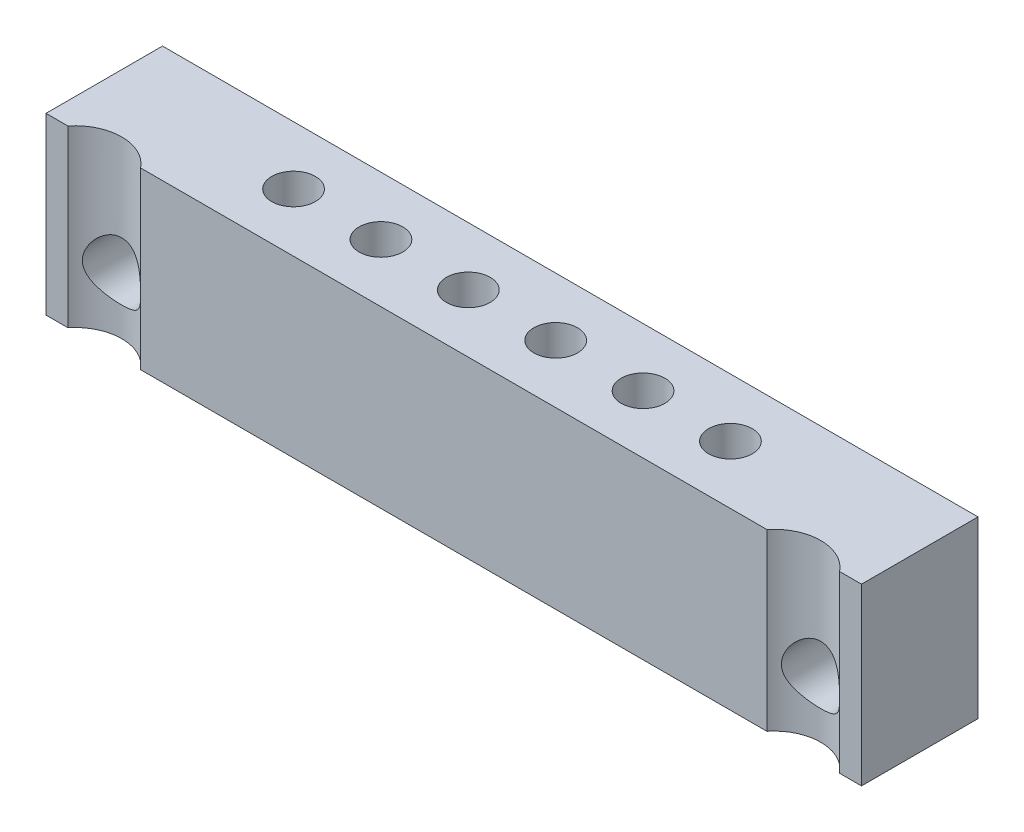
ISO-10303-21;
HEADER;
FILE_DESCRIPTION(('STEP AP214'),'2;1');
FILE_NAME('part.step','',(''),(''),'','','');
FILE_SCHEMA(('AUTOMOTIVE_DESIGN { 1 0 10303 214 1 1 1 1 }'));
ENDSEC;
DATA;
#1=APPLICATION_CONTEXT('core data for automotive mechanical design processes');
#2=APPLICATION_PROTOCOL_DEFINITION('international standard','automotive_design',2000,#1);
#3=PRODUCT_CONTEXT('',#1,'mechanical');
#4=PRODUCT('Part','Part','',(#3));
#5=PRODUCT_RELATED_PRODUCT_CATEGORY('part','',(#4));
#6=PRODUCT_DEFINITION_FORMATION('','',#4);
#7=PRODUCT_DEFINITION_CONTEXT('part definition',#1,'design');
#8=PRODUCT_DEFINITION('design','',#6,#7);
#9=PRODUCT_DEFINITION_SHAPE('','',#8);
#10=(LENGTH_UNIT() NAMED_UNIT(*) SI_UNIT(.MILLI.,.METRE.));
#11=(NAMED_UNIT(*) PLANE_ANGLE_UNIT() SI_UNIT($,.RADIAN.));
#12=(NAMED_UNIT(*) SI_UNIT($,.STERADIAN.) SOLID_ANGLE_UNIT());
#13=UNCERTAINTY_MEASURE_WITH_UNIT(LENGTH_MEASURE(1.E-05),#10,'distance_accuracy_value','');
#14=(GEOMETRIC_REPRESENTATION_CONTEXT(3) GLOBAL_UNCERTAINTY_ASSIGNED_CONTEXT((#13)) GLOBAL_UNIT_ASSIGNED_CONTEXT((#10,
#11,#12)) REPRESENTATION_CONTEXT('',''));
#15=CARTESIAN_POINT('',(0.,0.,0.));
#16=DIRECTION('',(0.,0.,1.));
#17=DIRECTION('',(1.,0.,0.));
#18=AXIS2_PLACEMENT_3D('',#15,#16,#17);
#19=CARTESIAN_POINT('',(0.,0.,4.));
#20=DIRECTION('',(0.,0.,-1.));
#21=DIRECTION('',(-1.,0.,0.));
#22=AXIS2_PLACEMENT_3D('',#19,#20,#21);
#23=PLANE('',#22);
#24=DIRECTION('',(-1.,0.,0.));
#25=VECTOR('',#24,1.);
#26=CARTESIAN_POINT('',(0.,6.,4.));
#27=LINE('',#26,#25);
#28=CARTESIAN_POINT('',(24.7510004003203,6.,4.));
#29=VERTEX_POINT('',#28);
#30=CARTESIAN_POINT('',(3.24899959967968,6.,4.));
#31=VERTEX_POINT('',#30);
#32=EDGE_CURVE('E119',#29,#31,#27,.T.);
#33=ORIENTED_EDGE('',*,*,#32,.T.);
#34=DIRECTION('',(0.,-1.,0.));
#35=VECTOR('',#34,1.);
#36=CARTESIAN_POINT('',(3.24899959967968,6.,4.));
#37=LINE('',#36,#35);
#38=CARTESIAN_POINT('',(3.24899959967968,0.,4.));
#39=VERTEX_POINT('',#38);
#40=EDGE_CURVE('E57',#31,#39,#37,.T.);
#41=ORIENTED_EDGE('',*,*,#40,.T.);
#42=DIRECTION('',(1.,0.,0.));
#43=VECTOR('',#42,1.);
#44=CARTESIAN_POINT('',(0.,0.,4.));
#45=LINE('',#44,#43);
#46=CARTESIAN_POINT('',(24.7510004003203,0.,4.));
#47=VERTEX_POINT('',#46);
#48=EDGE_CURVE('E121',#39,#47,#45,.T.);
#49=ORIENTED_EDGE('',*,*,#48,.T.);
#50=DIRECTION('',(0.,-1.,0.));
#51=VECTOR('',#50,1.);
#52=CARTESIAN_POINT('',(24.7510004003203,6.,4.));
#53=LINE('',#52,#51);
#54=EDGE_CURVE('E107',#47,#29,#53,.F.);
#55=ORIENTED_EDGE('',*,*,#54,.T.);
#56=EDGE_LOOP('',(#33,#41,#49,#55));
#57=FACE_BOUND('',#56,.T.);
#58=ADVANCED_FACE('F35',(#57),#23,.F.);
#59=CARTESIAN_POINT('',(28.,6.,4.));
#60=VERTEX_POINT('',#59);
#61=CARTESIAN_POINT('',(27.2489995996797,6.,4.));
#62=VERTEX_POINT('',#61);
#63=EDGE_CURVE('E127',#60,#62,#27,.T.);
#64=ORIENTED_EDGE('',*,*,#63,.T.);
#65=DIRECTION('',(0.,-1.,0.));
#66=VECTOR('',#65,1.);
#67=CARTESIAN_POINT('',(27.2489995996797,6.,4.));
#68=LINE('',#67,#66);
#69=CARTESIAN_POINT('',(27.2489995996797,0.,4.));
#70=VERTEX_POINT('',#69);
#71=EDGE_CURVE('E65',#62,#70,#68,.T.);
#72=ORIENTED_EDGE('',*,*,#71,.T.);
#73=CARTESIAN_POINT('',(28.,0.,4.));
#74=VERTEX_POINT('',#73);
#75=EDGE_CURVE('E215',#70,#74,#45,.T.);
#76=ORIENTED_EDGE('',*,*,#75,.T.);
#77=DIRECTION('',(0.,1.,0.));
#78=VECTOR('',#77,1.);
#79=CARTESIAN_POINT('',(28.,0.,4.));
#80=LINE('',#79,#78);
#81=EDGE_CURVE('E131',#74,#60,#80,.T.);
#82=ORIENTED_EDGE('',*,*,#81,.T.);
#83=EDGE_LOOP('',(#64,#72,#76,#82));
#84=FACE_BOUND('',#83,.T.);
#85=ADVANCED_FACE('F191',(#84),#23,.F.);
#86=CARTESIAN_POINT('',(0.,0.,4.));
#87=VERTEX_POINT('',#86);
#88=CARTESIAN_POINT('',(0.751000400320321,0.,4.));
#89=VERTEX_POINT('',#88);
#90=EDGE_CURVE('E209',#87,#89,#45,.T.);
#91=ORIENTED_EDGE('',*,*,#90,.T.);
#92=DIRECTION('',(0.,-1.,0.));
#93=VECTOR('',#92,1.);
#94=CARTESIAN_POINT('',(0.75100040032032,6.,4.));
#95=LINE('',#94,#93);
#96=CARTESIAN_POINT('',(0.751000400320321,6.,4.));
#97=VERTEX_POINT('',#96);
#98=EDGE_CURVE('E210',#89,#97,#95,.F.);
#99=ORIENTED_EDGE('',*,*,#98,.T.);
#100=CARTESIAN_POINT('',(0.,6.,4.));
#101=VERTEX_POINT('',#100);
#102=EDGE_CURVE('E128',#97,#101,#27,.T.);
#103=ORIENTED_EDGE('',*,*,#102,.T.);
#104=DIRECTION('',(0.,-1.,0.));
#105=VECTOR('',#104,1.);
#106=CARTESIAN_POINT('',(0.,0.,4.));
#107=LINE('',#106,#105);
#108=EDGE_CURVE('E145',#101,#87,#107,.T.);
#109=ORIENTED_EDGE('',*,*,#108,.T.);
#110=EDGE_LOOP('',(#91,#99,#103,#109));
#111=FACE_BOUND('',#110,.T.);
#112=ADVANCED_FACE('F193',(#111),#23,.F.);
#113=CARTESIAN_POINT('',(0.,0.,0.));
#114=DIRECTION('',(0.,0.,-1.));
#115=DIRECTION('',(-1.,0.,0.));
#116=AXIS2_PLACEMENT_3D('',#113,#114,#115);
#117=PLANE('',#116);
#118=CARTESIAN_POINT('',(2.,2.,0.));
#119=DIRECTION('',(0.,0.,1.));
#120=DIRECTION('',(1.,0.,0.));
#121=AXIS2_PLACEMENT_3D('',#118,#119,#120);
#122=CIRCLE('',#121,1.);
#123=CARTESIAN_POINT('',(3.,2.,0.));
#124=VERTEX_POINT('',#123);
#125=EDGE_CURVE('E139',#124,#124,#122,.T.);
#126=ORIENTED_EDGE('',*,*,#125,.T.);
#127=EDGE_LOOP('',(#126));
#128=FACE_BOUND('',#127,.T.);
#129=DIRECTION('',(0.,-1.,0.));
#130=VECTOR('',#129,1.);
#131=CARTESIAN_POINT('',(0.,0.,0.));
#132=LINE('',#131,#130);
#133=CARTESIAN_POINT('',(0.,6.,0.));
#134=VERTEX_POINT('',#133);
#135=CARTESIAN_POINT('',(0.,0.,0.));
#136=VERTEX_POINT('',#135);
#137=EDGE_CURVE('E135',#134,#136,#132,.T.);
#138=ORIENTED_EDGE('',*,*,#137,.F.);
#139=DIRECTION('',(-1.,0.,0.));
#140=VECTOR('',#139,1.);
#141=CARTESIAN_POINT('',(0.,6.,0.));
#142=LINE('',#141,#140);
#143=CARTESIAN_POINT('',(28.,6.,0.));
#144=VERTEX_POINT('',#143);
#145=EDGE_CURVE('E143',#144,#134,#142,.T.);
#146=ORIENTED_EDGE('',*,*,#145,.F.);
#147=DIRECTION('',(0.,1.,0.));
#148=VECTOR('',#147,1.);
#149=CARTESIAN_POINT('',(28.,0.,0.));
#150=LINE('',#149,#148);
#151=CARTESIAN_POINT('',(28.,0.,0.));
#152=VERTEX_POINT('',#151);
#153=EDGE_CURVE('E141',#152,#144,#150,.T.);
#154=ORIENTED_EDGE('',*,*,#153,.F.);
#155=DIRECTION('',(1.,0.,0.));
#156=VECTOR('',#155,1.);
#157=CARTESIAN_POINT('',(0.,0.,0.));
#158=LINE('',#157,#156);
#159=EDGE_CURVE('E138',#136,#152,#158,.T.);
#160=ORIENTED_EDGE('',*,*,#159,.F.);
#161=EDGE_LOOP('',(#138,#146,#154,#160));
#162=FACE_BOUND('',#161,.T.);
#163=CARTESIAN_POINT('',(26.,2.,0.));
#164=DIRECTION('',(0.,0.,1.));
#165=DIRECTION('',(-1.,0.,0.));
#166=AXIS2_PLACEMENT_3D('',#163,#164,#165);
#167=CIRCLE('',#166,1.);
#168=CARTESIAN_POINT('',(25.,2.,0.));
#169=VERTEX_POINT('',#168);
#170=EDGE_CURVE('E222',#169,#169,#167,.T.);
#171=ORIENTED_EDGE('',*,*,#170,.T.);
#172=EDGE_LOOP('',(#171));
#173=FACE_BOUND('',#172,.T.);
#174=ADVANCED_FACE('F200',(#128,#162,#173),#117,.T.);
#175=CARTESIAN_POINT('',(0.,0.,4.));
#176=DIRECTION('',(1.,0.,0.));
#177=DIRECTION('',(0.,0.,-1.));
#178=AXIS2_PLACEMENT_3D('',#175,#176,#177);
#179=PLANE('',#178);
#180=ORIENTED_EDGE('',*,*,#137,.T.);
#181=DIRECTION('',(0.,0.,-1.));
#182=VECTOR('',#181,1.);
#183=CARTESIAN_POINT('',(0.,0.,4.));
#184=LINE('',#183,#182);
#185=EDGE_CURVE('E11',#87,#136,#184,.T.);
#186=ORIENTED_EDGE('',*,*,#185,.F.);
#187=ORIENTED_EDGE('',*,*,#108,.F.);
#188=DIRECTION('',(0.,0.,-1.));
#189=VECTOR('',#188,1.);
#190=CARTESIAN_POINT('',(0.,6.,4.));
#191=LINE('',#190,#189);
#192=EDGE_CURVE('E130',#101,#134,#191,.T.);
#193=ORIENTED_EDGE('',*,*,#192,.T.);
#194=EDGE_LOOP('',(#180,#186,#187,#193));
#195=FACE_BOUND('',#194,.T.);
#196=ADVANCED_FACE('F37',(#195),#179,.F.);
#197=CARTESIAN_POINT('',(0.,0.,4.));
#198=DIRECTION('',(0.,1.,0.));
#199=DIRECTION('',(0.,0.,1.));
#200=AXIS2_PLACEMENT_3D('',#197,#198,#199);
#201=PLANE('',#200);
#202=CARTESIAN_POINT('',(15.5,0.,2.));
#203=DIRECTION('',(0.,-1.,0.));
#204=DIRECTION('',(0.,0.,1.));
#205=AXIS2_PLACEMENT_3D('',#202,#203,#204);
#206=CIRCLE('',#205,0.750000000000002);
#207=CARTESIAN_POINT('',(15.5,0.,2.75));
#208=VERTEX_POINT('',#207);
#209=EDGE_CURVE('E113',#208,#208,#206,.T.);
#210=ORIENTED_EDGE('',*,*,#209,.F.);
#211=EDGE_LOOP('',(#210));
#212=FACE_BOUND('',#211,.T.);
#213=CARTESIAN_POINT('',(18.5,0.,1.99999999999998));
#214=DIRECTION('',(0.,-1.,0.));
#215=DIRECTION('',(0.,0.,1.));
#216=AXIS2_PLACEMENT_3D('',#213,#214,#215);
#217=CIRCLE('',#216,0.750000000000002);
#218=CARTESIAN_POINT('',(18.5,0.,2.74999999999998));
#219=VERTEX_POINT('',#218);
#220=EDGE_CURVE('E260',#219,#219,#217,.T.);
#221=ORIENTED_EDGE('',*,*,#220,.F.);
#222=EDGE_LOOP('',(#221));
#223=FACE_BOUND('',#222,.T.);
#224=CARTESIAN_POINT('',(6.5,0.,1.99999999999996));
#225=DIRECTION('',(0.,-1.,0.));
#226=DIRECTION('',(0.,0.,-1.));
#227=AXIS2_PLACEMENT_3D('',#224,#225,#226);
#228=CIRCLE('',#227,0.75);
#229=CARTESIAN_POINT('',(6.5,0.,1.24999999999996));
#230=VERTEX_POINT('',#229);
#231=EDGE_CURVE('E228',#230,#230,#228,.T.);
#232=ORIENTED_EDGE('',*,*,#231,.F.);
#233=EDGE_LOOP('',(#232));
#234=FACE_BOUND('',#233,.T.);
#235=CARTESIAN_POINT('',(9.5,0.,1.99999999999998));
#236=DIRECTION('',(0.,-1.,0.));
#237=DIRECTION('',(0.,0.,-1.));
#238=AXIS2_PLACEMENT_3D('',#235,#236,#237);
#239=CIRCLE('',#238,0.75);
#240=CARTESIAN_POINT('',(9.5,0.,1.24999999999998));
#241=VERTEX_POINT('',#240);
#242=EDGE_CURVE('E235',#241,#241,#239,.T.);
#243=ORIENTED_EDGE('',*,*,#242,.F.);
#244=EDGE_LOOP('',(#243));
#245=FACE_BOUND('',#244,.T.);
#246=CARTESIAN_POINT('',(21.5,0.,1.99999999999996));
#247=DIRECTION('',(0.,-1.,0.));
#248=DIRECTION('',(0.,0.,1.));
#249=AXIS2_PLACEMENT_3D('',#246,#247,#248);
#250=CIRCLE('',#249,0.750000000000002);
#251=CARTESIAN_POINT('',(21.5,0.,2.74999999999996));
#252=VERTEX_POINT('',#251);
#253=EDGE_CURVE('E241',#252,#252,#250,.T.);
#254=ORIENTED_EDGE('',*,*,#253,.F.);
#255=EDGE_LOOP('',(#254));
#256=FACE_BOUND('',#255,.T.);
#257=CARTESIAN_POINT('',(12.5,0.,2.));
#258=DIRECTION('',(0.,-1.,0.));
#259=DIRECTION('',(0.,0.,-1.));
#260=AXIS2_PLACEMENT_3D('',#257,#258,#259);
#261=CIRCLE('',#260,0.75);
#262=CARTESIAN_POINT('',(12.5,0.,1.25));
#263=VERTEX_POINT('',#262);
#264=EDGE_CURVE('E247',#263,#263,#261,.T.);
#265=ORIENTED_EDGE('',*,*,#264,.F.);
#266=EDGE_LOOP('',(#265));
#267=FACE_BOUND('',#266,.T.);
#268=ORIENTED_EDGE('',*,*,#48,.F.);
#269=CARTESIAN_POINT('',(2.,0.,5.));
#270=DIRECTION('',(0.,-1.,0.));
#271=DIRECTION('',(0.,0.,-1.));
#272=AXIS2_PLACEMENT_3D('',#269,#270,#271);
#273=CIRCLE('',#272,1.6);
#274=EDGE_CURVE('E253',#89,#39,#273,.T.);
#275=ORIENTED_EDGE('',*,*,#274,.F.);
#276=ORIENTED_EDGE('',*,*,#90,.F.);
#277=ORIENTED_EDGE('',*,*,#185,.T.);
#278=ORIENTED_EDGE('',*,*,#159,.T.);
#279=DIRECTION('',(0.,0.,-1.));
#280=VECTOR('',#279,1.);
#281=CARTESIAN_POINT('',(28.,0.,4.));
#282=LINE('',#281,#280);
#283=EDGE_CURVE('E49',#74,#152,#282,.T.);
#284=ORIENTED_EDGE('',*,*,#283,.F.);
#285=ORIENTED_EDGE('',*,*,#75,.F.);
#286=CARTESIAN_POINT('',(26.,0.,5.));
#287=DIRECTION('',(0.,-1.,0.));
#288=DIRECTION('',(0.,0.,1.));
#289=AXIS2_PLACEMENT_3D('',#286,#287,#288);
#290=CIRCLE('',#289,1.6);
#291=EDGE_CURVE('E114',#47,#70,#290,.T.);
#292=ORIENTED_EDGE('',*,*,#291,.F.);
#293=EDGE_LOOP('',(#268,#275,#276,#277,#278,#284,#285,#292));
#294=FACE_BOUND('',#293,.T.);
#295=ADVANCED_FACE('F266',(#212,#223,#234,#245,#256,#267,#294),#201,.F.);
#296=CARTESIAN_POINT('',(28.,0.,4.));
#297=DIRECTION('',(-1.,0.,0.));
#298=DIRECTION('',(0.,0.,1.));
#299=AXIS2_PLACEMENT_3D('',#296,#297,#298);
#300=PLANE('',#299);
#301=ORIENTED_EDGE('',*,*,#153,.T.);
#302=DIRECTION('',(0.,0.,-1.));
#303=VECTOR('',#302,1.);
#304=CARTESIAN_POINT('',(28.,6.,4.));
#305=LINE('',#304,#303);
#306=EDGE_CURVE('E148',#60,#144,#305,.T.);
#307=ORIENTED_EDGE('',*,*,#306,.F.);
#308=ORIENTED_EDGE('',*,*,#81,.F.);
#309=ORIENTED_EDGE('',*,*,#283,.T.);
#310=EDGE_LOOP('',(#301,#307,#308,#309));
#311=FACE_BOUND('',#310,.T.);
#312=ADVANCED_FACE('F277',(#311),#300,.F.);
#313=CARTESIAN_POINT('',(0.,6.,4.));
#314=DIRECTION('',(0.,-1.,0.));
#315=DIRECTION('',(1.,0.,0.));
#316=AXIS2_PLACEMENT_3D('',#313,#314,#315);
#317=PLANE('',#316);
#318=CARTESIAN_POINT('',(15.5,6.,2.));
#319=DIRECTION('',(0.,-1.,0.));
#320=DIRECTION('',(0.,0.,1.));
#321=AXIS2_PLACEMENT_3D('',#318,#319,#320);
#322=CIRCLE('',#321,0.750000000000002);
#323=CARTESIAN_POINT('',(15.5,6.,2.75));
#324=VERTEX_POINT('',#323);
#325=EDGE_CURVE('E257',#324,#324,#322,.T.);
#326=ORIENTED_EDGE('',*,*,#325,.T.);
#327=EDGE_LOOP('',(#326));
#328=FACE_BOUND('',#327,.T.);
#329=CARTESIAN_POINT('',(18.5,6.,1.99999999999998));
#330=DIRECTION('',(0.,-1.,0.));
#331=DIRECTION('',(0.,0.,1.));
#332=AXIS2_PLACEMENT_3D('',#329,#330,#331);
#333=CIRCLE('',#332,0.750000000000002);
#334=CARTESIAN_POINT('',(18.5,6.,2.74999999999998));
#335=VERTEX_POINT('',#334);
#336=EDGE_CURVE('E232',#335,#335,#333,.T.);
#337=ORIENTED_EDGE('',*,*,#336,.T.);
#338=EDGE_LOOP('',(#337));
#339=FACE_BOUND('',#338,.T.);
#340=CARTESIAN_POINT('',(6.5,6.,1.99999999999996));
#341=DIRECTION('',(0.,-1.,0.));
#342=DIRECTION('',(0.,0.,-1.));
#343=AXIS2_PLACEMENT_3D('',#340,#341,#342);
#344=CIRCLE('',#343,0.75);
#345=CARTESIAN_POINT('',(6.5,6.,1.24999999999996));
#346=VERTEX_POINT('',#345);
#347=EDGE_CURVE('E231',#346,#346,#344,.T.);
#348=ORIENTED_EDGE('',*,*,#347,.T.);
#349=EDGE_LOOP('',(#348));
#350=FACE_BOUND('',#349,.T.);
#351=CARTESIAN_POINT('',(9.5,6.,1.99999999999998));
#352=DIRECTION('',(0.,-1.,0.));
#353=DIRECTION('',(0.,0.,-1.));
#354=AXIS2_PLACEMENT_3D('',#351,#352,#353);
#355=CIRCLE('',#354,0.75);
#356=CARTESIAN_POINT('',(9.5,6.,1.24999999999998));
#357=VERTEX_POINT('',#356);
#358=EDGE_CURVE('E238',#357,#357,#355,.T.);
#359=ORIENTED_EDGE('',*,*,#358,.T.);
#360=EDGE_LOOP('',(#359));
#361=FACE_BOUND('',#360,.T.);
#362=CARTESIAN_POINT('',(21.5,6.,1.99999999999996));
#363=DIRECTION('',(0.,-1.,0.));
#364=DIRECTION('',(0.,0.,1.));
#365=AXIS2_PLACEMENT_3D('',#362,#363,#364);
#366=CIRCLE('',#365,0.750000000000002);
#367=CARTESIAN_POINT('',(21.5,6.,2.74999999999996));
#368=VERTEX_POINT('',#367);
#369=EDGE_CURVE('E244',#368,#368,#366,.T.);
#370=ORIENTED_EDGE('',*,*,#369,.T.);
#371=EDGE_LOOP('',(#370));
#372=FACE_BOUND('',#371,.T.);
#373=CARTESIAN_POINT('',(12.5,6.,2.));
#374=DIRECTION('',(0.,-1.,0.));
#375=DIRECTION('',(0.,0.,-1.));
#376=AXIS2_PLACEMENT_3D('',#373,#374,#375);
#377=CIRCLE('',#376,0.75);
#378=CARTESIAN_POINT('',(12.5,6.,1.25));
#379=VERTEX_POINT('',#378);
#380=EDGE_CURVE('E250',#379,#379,#377,.T.);
#381=ORIENTED_EDGE('',*,*,#380,.T.);
#382=EDGE_LOOP('',(#381));
#383=FACE_BOUND('',#382,.T.);
#384=ORIENTED_EDGE('',*,*,#102,.F.);
#385=CARTESIAN_POINT('',(2.,6.,5.));
#386=DIRECTION('',(0.,-1.,0.));
#387=DIRECTION('',(0.,0.,-1.));
#388=AXIS2_PLACEMENT_3D('',#385,#386,#387);
#389=CIRCLE('',#388,1.6);
#390=EDGE_CURVE('E126',#97,#31,#389,.T.);
#391=ORIENTED_EDGE('',*,*,#390,.T.);
#392=ORIENTED_EDGE('',*,*,#32,.F.);
#393=CARTESIAN_POINT('',(26.,6.,5.));
#394=DIRECTION('',(0.,-1.,0.));
#395=DIRECTION('',(0.,0.,1.));
#396=AXIS2_PLACEMENT_3D('',#393,#394,#395);
#397=CIRCLE('',#396,1.6);
#398=EDGE_CURVE('E104',#29,#62,#397,.T.);
#399=ORIENTED_EDGE('',*,*,#398,.T.);
#400=ORIENTED_EDGE('',*,*,#63,.F.);
#401=ORIENTED_EDGE('',*,*,#306,.T.);
#402=ORIENTED_EDGE('',*,*,#145,.T.);
#403=ORIENTED_EDGE('',*,*,#192,.F.);
#404=EDGE_LOOP('',(#384,#391,#392,#399,#400,#401,#402,#403));
#405=FACE_BOUND('',#404,.T.);
#406=ADVANCED_FACE('F125',(#328,#339,#350,#361,#372,#383,#405),#317,.F.);
#407=CARTESIAN_POINT('',(2.,2.,4.));
#408=DIRECTION('',(0.,0.,-1.));
#409=DIRECTION('',(-1.,0.,0.));
#410=AXIS2_PLACEMENT_3D('',#407,#408,#409);
#411=CYLINDRICAL_SURFACE('',#410,1.);
#412=CARTESIAN_POINT('',(1.,2.,3.75100040032032));
#413=CARTESIAN_POINT('',(1.00000430231612,2.04969622544234,3.75099359941953));
#414=CARTESIAN_POINT('',(1.00373844920268,2.0994702682962,3.74797885832931));
#415=CARTESIAN_POINT('',(1.01840839333653,2.1973410560635,3.73645026235618));
#416=CARTESIAN_POINT('',(1.02936375655559,2.24543286909219,3.72792146828708));
#417=CARTESIAN_POINT('',(1.05769540870503,2.33822585815907,3.70679931736767));
#418=CARTESIAN_POINT('',(1.07501605333772,2.38295248694545,3.69424130065574));
#419=CARTESIAN_POINT('',(1.11542443550461,2.46880708931052,3.66653639428454));
#420=CARTESIAN_POINT('',(1.13851233035127,2.5099349646852,3.65138943401059));
#421=CARTESIAN_POINT('',(1.19340849657309,2.59349212358158,3.61776310900231));
#422=CARTESIAN_POINT('',(1.225971125046,2.63535579266607,3.59910929418123));
#423=CARTESIAN_POINT('',(1.2973530684025,2.71350615931597,3.56197743316099));
#424=CARTESIAN_POINT('',(1.33617777496207,2.74978799782714,3.54349955309337));
#425=CARTESIAN_POINT('',(1.42465066779321,2.8200828681185,3.50616436887193));
#426=CARTESIAN_POINT('',(1.47503954487155,2.85329413448344,3.4875302220684));
#427=CARTESIAN_POINT('',(1.58207674333015,2.91050016381053,3.45453414640688));
#428=CARTESIAN_POINT('',(1.63871879481741,2.934504052601,3.4401679905613));
#429=CARTESIAN_POINT('',(1.75057849731039,2.96998584848565,3.4186412694544));
#430=CARTESIAN_POINT('',(1.80535549116221,2.98248913311755,3.41089662062369));
#431=CARTESIAN_POINT('',(1.91671591947019,2.99810565571472,3.40119564496639));
#432=CARTESIAN_POINT('',(1.97329739154878,3.00122876489644,3.39923323325075));
#433=CARTESIAN_POINT('',(2.07845266273707,2.99811544857791,3.40117672713978));
#434=CARTESIAN_POINT('',(2.12708201861903,2.99307889895928,3.40433040150478));
#435=CARTESIAN_POINT('',(2.22264531672294,2.97610641250934,3.4148378219102));
#436=CARTESIAN_POINT('',(2.26957913051758,2.96416995420999,3.42219188539906));
#437=CARTESIAN_POINT('',(2.36071129366166,2.93391697992231,3.4404949310826));
#438=CARTESIAN_POINT('',(2.40490230039459,2.91558414076113,3.4514531066087));
#439=CARTESIAN_POINT('',(2.48961537637551,2.87322499579201,3.47611493688535));
#440=CARTESIAN_POINT('',(2.530136606848,2.84919739288752,3.48981921700619));
#441=CARTESIAN_POINT('',(2.61177081245363,2.79277746773651,3.52085420199366));
#442=CARTESIAN_POINT('',(2.65232987593516,2.75971629860613,3.53842396554285));
#443=CARTESIAN_POINT('',(2.7276788767244,2.6878940958213,3.5744362979821));
#444=CARTESIAN_POINT('',(2.76246027103171,2.64912477884276,3.59288010840663));
#445=CARTESIAN_POINT('',(2.82988356714345,2.56103550167512,3.63142846310244));
#446=CARTESIAN_POINT('',(2.86165292383957,2.51099889531976,3.65143534773444));
#447=CARTESIAN_POINT('',(2.91620922562647,2.40508310418126,3.6878868872368));
#448=CARTESIAN_POINT('',(2.93901271682686,2.34921492483567,3.70433807846656));
#449=CARTESIAN_POINT('',(2.96974853482533,2.2481844776897,3.72726498746304));
#450=CARTESIAN_POINT('',(2.98001473377377,2.20407122988986,3.73522636555782));
#451=CARTESIAN_POINT('',(2.99448134830019,2.11430784900085,3.74656688899388));
#452=CARTESIAN_POINT('',(2.9986900508262,2.06865990316808,3.74995229410058));
#453=CARTESIAN_POINT('',(3.00078828763607,1.97701705556779,3.75163093175869));
#454=CARTESIAN_POINT('',(2.99866334061261,1.93102159890735,3.74991249487652));
#455=CARTESIAN_POINT('',(2.9882058684479,1.84017553517472,3.74163165709836));
#456=CARTESIAN_POINT('',(2.9798682025621,1.79532590802966,3.73506524476275));
#457=CARTESIAN_POINT('',(2.95763948579864,1.70862529290736,3.71815951518434));
#458=CARTESIAN_POINT('',(2.94384224501431,1.66673706133479,3.70788417650263));
#459=CARTESIAN_POINT('',(2.91121961550818,1.58577013235442,3.68467541247327));
#460=CARTESIAN_POINT('',(2.89239244217137,1.54669243838041,3.67174104408073));
#461=CARTESIAN_POINT('',(2.84612301417856,1.46455516865838,3.64170236808851));
#462=CARTESIAN_POINT('',(2.81772299051377,1.42215396700054,3.62427299409368));
#463=CARTESIAN_POINT('',(2.75495221057989,1.34225195804868,3.58884833599431));
#464=CARTESIAN_POINT('',(2.72057525959728,1.30475630641763,3.57085248077317));
#465=CARTESIAN_POINT('',(2.64030452759936,1.22961340300548,3.53293468784822));
#466=CARTESIAN_POINT('',(2.59344795977133,1.19290515439386,3.51316636169922));
#467=CARTESIAN_POINT('',(2.49303999029566,1.12794507849932,3.47692600828001));
#468=CARTESIAN_POINT('',(2.43949174299893,1.09968928802109,3.46045243736694));
#469=CARTESIAN_POINT('',(2.33034072050928,1.05440400703789,3.43352595233951));
#470=CARTESIAN_POINT('',(2.27505185803562,1.03680463482339,3.42277212328656));
#471=CARTESIAN_POINT('',(2.1614887991078,1.01141866505513,3.40714391929568));
#472=CARTESIAN_POINT('',(2.10321885059069,1.00361848819111,3.40226140853597));
#473=CARTESIAN_POINT('',(1.99472074240255,0.998762783968973,3.39922651401153));
#474=CARTESIAN_POINT('',(1.94457496192362,1.00029137857041,3.40018719501107));
#475=CARTESIAN_POINT('',(1.84537615112662,1.01076933997947,3.40671408032982));
#476=CARTESIAN_POINT('',(1.79632307132741,1.01971837006061,3.41228007566786));
#477=CARTESIAN_POINT('',(1.70236536425158,1.04412837990127,3.42723116248816));
#478=CARTESIAN_POINT('',(1.65737585545735,1.05935267189856,3.43647706022639));
#479=CARTESIAN_POINT('',(1.57062850471095,1.09564794253125,3.45804025058188));
#480=CARTESIAN_POINT('',(1.52887120950541,1.11671990758047,3.47035806134876));
#481=CARTESIAN_POINT('',(1.44507461002347,1.16652846319296,3.4985972620814));
#482=CARTESIAN_POINT('',(1.40345589827023,1.19583358505519,3.51475998026435));
#483=CARTESIAN_POINT('',(1.32542671331567,1.26006130426616,3.5485308763501));
#484=CARTESIAN_POINT('',(1.28902220555582,1.29499024019675,3.56614067415504));
#485=CARTESIAN_POINT('',(1.21702111895936,1.37529300984262,3.6039966792038));
#486=CARTESIAN_POINT('',(1.18229736100947,1.42144667614153,3.62425702842949));
#487=CARTESIAN_POINT('',(1.12098139995405,1.51971573280809,3.66260142802371));
#488=CARTESIAN_POINT('',(1.0943846995432,1.57182780392608,3.68068667866359));
#489=CARTESIAN_POINT('',(1.05520711261415,1.66912221434373,3.70856179135829));
#490=CARTESIAN_POINT('',(1.04083026978895,1.71330854470349,3.71930127720278));
#491=CARTESIAN_POINT('',(1.01829742255674,1.80397542236575,3.73648673249648));
#492=CARTESIAN_POINT('',(1.01012172603676,1.85044820401931,3.7429462847986));
#493=CARTESIAN_POINT('',(1.00352075053522,1.91442441909028,3.74818834888485));
#494=CARTESIAN_POINT('',(1.00220262992335,1.93149131641359,3.74923944362539));
#495=CARTESIAN_POINT('',(1.0004414021257,1.96570237321719,3.75064673043963));
#496=CARTESIAN_POINT('',(0.999998514986615,1.98284655104135,3.75100274776026));
#497=CARTESIAN_POINT('',(1.,2.,3.75100040032032));
#498=B_SPLINE_CURVE_WITH_KNOTS('',3,(#412,#413,#414,#415,#416,#417,#418,#419,#420,#421,#422,
#423,#424,#425,#426,#427,#428,#429,#430,#431,#432,#433,#434,#435,#436,#437,#438,#439,#440,#441,
#442,#443,#444,#445,#446,#447,#448,#449,#450,#451,#452,#453,#454,#455,#456,#457,#458,#459,#460,
#461,#462,#463,#464,#465,#466,#467,#468,#469,#470,#471,#472,#473,#474,#475,#476,#477,#478,#479,
#480,#481,#482,#483,#484,#485,#486,#487,#488,#489,#490,#491,#492,#493,#494,#495,#496,#497),
.UNSPECIFIED.,.T.,.F.,(4,2,2,2,2,2,2,2,2,2,2,2,2,2,2,2,2,2,2,2,2,2,2,2,2,2,2,2,2,2,2,2,2,2,2,2,
2,2,2,2,2,2,4),(0.,0.149009955209611,0.298425323517676,0.446564444904321,0.5947076075022,
0.762724965952059,0.930887767983289,1.11933788827565,1.30760074191408,1.47672330252318,
1.6456678247391,1.79193855666809,1.93822034461131,2.08487819860765,2.23156948902537,
2.39651603865686,2.56170435212948,2.74846454336657,2.93487844076222,3.07226220384214,
3.20945784005832,3.34696740192591,3.48459087328065,3.61994569874879,3.75534861189708,
3.91653066888103,4.07788078788203,4.26509278928711,4.452216872493,4.62816064395639,
4.80386033007169,4.95362881220099,5.10339049846866,5.24795655291539,5.39254700830304,
5.55214515286996,5.71192445567094,5.89473453936999,6.07744327668309,6.2199752181633,
6.36205262370708,6.41347287255598,6.46490604757618),.UNSPECIFIED.);
#499=CARTESIAN_POINT('',(1.,2.,3.75100040032032));
#500=VERTEX_POINT('',#499);
#501=EDGE_CURVE('E39',#500,#500,#498,.T.);
#502=ORIENTED_EDGE('',*,*,#501,.F.);
#503=EDGE_LOOP('',(#502));
#504=FACE_BOUND('',#503,.T.);
#505=ORIENTED_EDGE('',*,*,#125,.F.);
#506=EDGE_LOOP('',(#505));
#507=FACE_BOUND('',#506,.T.);
#508=ADVANCED_FACE('F284',(#504,#507),#411,.F.);
#509=CARTESIAN_POINT('',(26.,2.,4.));
#510=DIRECTION('',(0.,0.,-1.));
#511=DIRECTION('',(-1.,0.,0.));
#512=AXIS2_PLACEMENT_3D('',#509,#510,#511);
#513=CYLINDRICAL_SURFACE('',#512,1.);
#514=CARTESIAN_POINT('',(25.,2.,3.75100040032032));
#515=CARTESIAN_POINT('',(25.0000043023161,2.04969622544234,3.75099359941953));
#516=CARTESIAN_POINT('',(25.0037384492027,2.0994702682962,3.7479788583293));
#517=CARTESIAN_POINT('',(25.0184083933365,2.1973410560635,3.73645026235618));
#518=CARTESIAN_POINT('',(25.0293637565556,2.24543286909219,3.72792146828708));
#519=CARTESIAN_POINT('',(25.057695408705,2.33822585815907,3.70679931736767));
#520=CARTESIAN_POINT('',(25.0750160533377,2.38295248694545,3.69424130065574));
#521=CARTESIAN_POINT('',(25.1154244355046,2.46880708931052,3.66653639428454));
#522=CARTESIAN_POINT('',(25.1385123303513,2.5099349646852,3.65138943401059));
#523=CARTESIAN_POINT('',(25.1934084965731,2.59349212358158,3.61776310900231));
#524=CARTESIAN_POINT('',(25.225971125046,2.63535579266607,3.59910929418123));
#525=CARTESIAN_POINT('',(25.2973530684025,2.71350615931597,3.56197743316099));
#526=CARTESIAN_POINT('',(25.3361777749621,2.74978799782714,3.54349955309337));
#527=CARTESIAN_POINT('',(25.4246506677932,2.8200828681185,3.50616436887192));
#528=CARTESIAN_POINT('',(25.4750395448716,2.85329413448345,3.4875302220684));
#529=CARTESIAN_POINT('',(25.5820767433302,2.91050016381053,3.45453414640688));
#530=CARTESIAN_POINT('',(25.6387187948174,2.934504052601,3.4401679905613));
#531=CARTESIAN_POINT('',(25.7505784973104,2.96998584848565,3.41864126945439));
#532=CARTESIAN_POINT('',(25.8053554911622,2.98248913311755,3.41089662062369));
#533=CARTESIAN_POINT('',(25.9167159194702,2.99810565571472,3.40119564496638));
#534=CARTESIAN_POINT('',(25.9732973915488,3.00122876489644,3.39923323325074));
#535=CARTESIAN_POINT('',(26.0784526627371,2.99811544857791,3.40117672713978));
#536=CARTESIAN_POINT('',(26.127082018619,2.99307889895928,3.40433040150478));
#537=CARTESIAN_POINT('',(26.2226453167229,2.97610641250935,3.4148378219102));
#538=CARTESIAN_POINT('',(26.2695791305176,2.96416995420999,3.42219188539906));
#539=CARTESIAN_POINT('',(26.3607112936617,2.93391697992231,3.4404949310826));
#540=CARTESIAN_POINT('',(26.4049023003946,2.91558414076113,3.4514531066087));
#541=CARTESIAN_POINT('',(26.4896153763755,2.87322499579201,3.47611493688535));
#542=CARTESIAN_POINT('',(26.530136606848,2.84919739288752,3.48981921700619));
#543=CARTESIAN_POINT('',(26.6117708124536,2.79277746773651,3.52085420199365));
#544=CARTESIAN_POINT('',(26.6523298759352,2.75971629860613,3.53842396554285));
#545=CARTESIAN_POINT('',(26.7276788767244,2.6878940958213,3.5744362979821));
#546=CARTESIAN_POINT('',(26.7624602710317,2.64912477884276,3.59288010840663));
#547=CARTESIAN_POINT('',(26.8298835671435,2.56103550167512,3.63142846310243));
#548=CARTESIAN_POINT('',(26.8616529238396,2.51099889531976,3.65143534773444));
#549=CARTESIAN_POINT('',(26.9162092256265,2.40508310418126,3.6878868872368));
#550=CARTESIAN_POINT('',(26.9390127168269,2.34921492483567,3.70433807846656));
#551=CARTESIAN_POINT('',(26.9697485348253,2.2481844776897,3.72726498746304));
#552=CARTESIAN_POINT('',(26.9800147337738,2.20407122988986,3.73522636555782));
#553=CARTESIAN_POINT('',(26.9944813483002,2.11430784900086,3.74656688899388));
#554=CARTESIAN_POINT('',(26.9986900508262,2.06865990316808,3.74995229410057));
#555=CARTESIAN_POINT('',(27.0007882876361,1.97701705556779,3.75163093175869));
#556=CARTESIAN_POINT('',(26.9986633406126,1.93102159890735,3.74991249487652));
#557=CARTESIAN_POINT('',(26.9882058684479,1.84017553517472,3.74163165709836));
#558=CARTESIAN_POINT('',(26.9798682025621,1.79532590802966,3.73506524476275));
#559=CARTESIAN_POINT('',(26.9576394857986,1.70862529290736,3.71815951518434));
#560=CARTESIAN_POINT('',(26.9438422450143,1.66673706133479,3.70788417650263));
#561=CARTESIAN_POINT('',(26.9112196155082,1.58577013235442,3.68467541247327));
#562=CARTESIAN_POINT('',(26.8923924421714,1.54669243838041,3.67174104408073));
#563=CARTESIAN_POINT('',(26.8461230141786,1.46455516865838,3.64170236808851));
#564=CARTESIAN_POINT('',(26.8177229905138,1.42215396700054,3.62427299409368));
#565=CARTESIAN_POINT('',(26.7549522105799,1.34225195804868,3.58884833599431));
#566=CARTESIAN_POINT('',(26.7205752595973,1.30475630641763,3.57085248077317));
#567=CARTESIAN_POINT('',(26.6403045275994,1.22961340300548,3.53293468784822));
#568=CARTESIAN_POINT('',(26.5934479597713,1.19290515439386,3.51316636169922));
#569=CARTESIAN_POINT('',(26.4930399902957,1.12794507849932,3.47692600828001));
#570=CARTESIAN_POINT('',(26.4394917429989,1.09968928802109,3.46045243736694));
#571=CARTESIAN_POINT('',(26.3303407205093,1.05440400703789,3.43352595233951));
#572=CARTESIAN_POINT('',(26.2750518580356,1.03680463482339,3.42277212328656));
#573=CARTESIAN_POINT('',(26.1614887991078,1.01141866505513,3.40714391929568));
#574=CARTESIAN_POINT('',(26.1032188505907,1.00361848819111,3.40226140853597));
#575=CARTESIAN_POINT('',(25.9947207424026,0.998762783968972,3.39922651401153));
#576=CARTESIAN_POINT('',(25.9445749619236,1.00029137857041,3.40018719501106));
#577=CARTESIAN_POINT('',(25.8453761511266,1.01076933997947,3.40671408032982));
#578=CARTESIAN_POINT('',(25.7963230713274,1.01971837006061,3.41228007566785));
#579=CARTESIAN_POINT('',(25.7023653642516,1.04412837990127,3.42723116248816));
#580=CARTESIAN_POINT('',(25.6573758554574,1.05935267189856,3.43647706022639));
#581=CARTESIAN_POINT('',(25.570628504711,1.09564794253125,3.45804025058188));
#582=CARTESIAN_POINT('',(25.5288712095054,1.11671990758047,3.47035806134875));
#583=CARTESIAN_POINT('',(25.4450746100235,1.16652846319296,3.4985972620814));
#584=CARTESIAN_POINT('',(25.4034558982702,1.19583358505518,3.51475998026435));
#585=CARTESIAN_POINT('',(25.3254267133157,1.26006130426616,3.5485308763501));
#586=CARTESIAN_POINT('',(25.2890222055558,1.29499024019675,3.56614067415503));
#587=CARTESIAN_POINT('',(25.2170211189594,1.37529300984261,3.6039966792038));
#588=CARTESIAN_POINT('',(25.1822973610095,1.42144667614153,3.62425702842949));
#589=CARTESIAN_POINT('',(25.1209813999541,1.51971573280809,3.66260142802371));
#590=CARTESIAN_POINT('',(25.0943846995432,1.57182780392608,3.68068667866359));
#591=CARTESIAN_POINT('',(25.0552071126142,1.66912221434373,3.70856179135829));
#592=CARTESIAN_POINT('',(25.040830269789,1.71330854470349,3.71930127720278));
#593=CARTESIAN_POINT('',(25.0182974225567,1.80397542236575,3.73648673249648));
#594=CARTESIAN_POINT('',(25.0101217260368,1.85044820401931,3.74294628479859));
#595=CARTESIAN_POINT('',(25.0035207505352,1.91442441909028,3.74818834888485));
#596=CARTESIAN_POINT('',(25.0022026299234,1.93149131641359,3.74923944362538));
#597=CARTESIAN_POINT('',(25.0004414021257,1.96570237321719,3.75064673043963));
#598=CARTESIAN_POINT('',(24.9999985149866,1.98284655104135,3.75100274776026));
#599=CARTESIAN_POINT('',(25.,2.,3.75100040032032));
#600=B_SPLINE_CURVE_WITH_KNOTS('',3,(#514,#515,#516,#517,#518,#519,#520,#521,#522,#523,#524,
#525,#526,#527,#528,#529,#530,#531,#532,#533,#534,#535,#536,#537,#538,#539,#540,#541,#542,#543,
#544,#545,#546,#547,#548,#549,#550,#551,#552,#553,#554,#555,#556,#557,#558,#559,#560,#561,#562,
#563,#564,#565,#566,#567,#568,#569,#570,#571,#572,#573,#574,#575,#576,#577,#578,#579,#580,#581,
#582,#583,#584,#585,#586,#587,#588,#589,#590,#591,#592,#593,#594,#595,#596,#597,#598,#599),
.UNSPECIFIED.,.T.,.F.,(4,2,2,2,2,2,2,2,2,2,2,2,2,2,2,2,2,2,2,2,2,2,2,2,2,2,2,2,2,2,2,2,2,2,2,2,
2,2,2,2,2,2,4),(0.,0.149009955209612,0.298425323517677,0.44656444490432,0.5947076075022,
0.762724965952058,0.93088776798329,1.11933788827566,1.30760074191408,1.47672330252318,
1.6456678247391,1.79193855666809,1.93822034461132,2.08487819860766,2.23156948902538,
2.39651603865686,2.56170435212949,2.74846454336657,2.93487844076222,3.07226220384214,
3.20945784005832,3.34696740192591,3.48459087328065,3.61994569874879,3.75534861189709,
3.91653066888103,4.07788078788203,4.26509278928711,4.45221687249301,4.6281606439564,
4.80386033007169,4.953628812201,5.10339049846867,5.24795655291539,5.39254700830305,
5.55214515286996,5.71192445567094,5.89473453936999,6.07744327668309,6.2199752181633,
6.36205262370709,6.41347287255599,6.46490604757618),.UNSPECIFIED.);
#601=CARTESIAN_POINT('',(25.,2.,3.75100040032032));
#602=VERTEX_POINT('',#601);
#603=EDGE_CURVE('E122',#602,#602,#600,.T.);
#604=ORIENTED_EDGE('',*,*,#603,.F.);
#605=EDGE_LOOP('',(#604));
#606=FACE_BOUND('',#605,.T.);
#607=ORIENTED_EDGE('',*,*,#170,.F.);
#608=EDGE_LOOP('',(#607));
#609=FACE_BOUND('',#608,.T.);
#610=ADVANCED_FACE('F158',(#606,#609),#513,.F.);
#611=CARTESIAN_POINT('',(26.,6.,5.));
#612=DIRECTION('',(0.,-1.,0.));
#613=DIRECTION('',(0.,0.,-1.));
#614=AXIS2_PLACEMENT_3D('',#611,#612,#613);
#615=CYLINDRICAL_SURFACE('',#614,1.6);
#616=ORIENTED_EDGE('',*,*,#603,.T.);
#617=EDGE_LOOP('',(#616));
#618=FACE_BOUND('',#617,.T.);
#619=ORIENTED_EDGE('',*,*,#398,.F.);
#620=ORIENTED_EDGE('',*,*,#54,.F.);
#621=ORIENTED_EDGE('',*,*,#291,.T.);
#622=ORIENTED_EDGE('',*,*,#71,.F.);
#623=EDGE_LOOP('',(#619,#620,#621,#622));
#624=FACE_BOUND('',#623,.T.);
#625=ADVANCED_FACE('F106',(#618,#624),#615,.F.);
#626=CARTESIAN_POINT('',(2.,6.,5.));
#627=DIRECTION('',(0.,-1.,0.));
#628=DIRECTION('',(0.,0.,-1.));
#629=AXIS2_PLACEMENT_3D('',#626,#627,#628);
#630=CYLINDRICAL_SURFACE('',#629,1.6);
#631=ORIENTED_EDGE('',*,*,#501,.T.);
#632=EDGE_LOOP('',(#631));
#633=FACE_BOUND('',#632,.T.);
#634=ORIENTED_EDGE('',*,*,#390,.F.);
#635=ORIENTED_EDGE('',*,*,#98,.F.);
#636=ORIENTED_EDGE('',*,*,#274,.T.);
#637=ORIENTED_EDGE('',*,*,#40,.F.);
#638=EDGE_LOOP('',(#634,#635,#636,#637));
#639=FACE_BOUND('',#638,.T.);
#640=ADVANCED_FACE('F165',(#633,#639),#630,.F.);
#641=CARTESIAN_POINT('',(12.5,6.,2.));
#642=DIRECTION('',(0.,-1.,0.));
#643=DIRECTION('',(0.,0.,-1.));
#644=AXIS2_PLACEMENT_3D('',#641,#642,#643);
#645=CYLINDRICAL_SURFACE('',#644,0.75);
#646=ORIENTED_EDGE('',*,*,#380,.F.);
#647=EDGE_LOOP('',(#646));
#648=FACE_BOUND('',#647,.T.);
#649=ORIENTED_EDGE('',*,*,#264,.T.);
#650=EDGE_LOOP('',(#649));
#651=FACE_BOUND('',#650,.T.);
#652=ADVANCED_FACE('F169',(#648,#651),#645,.F.);
#653=CARTESIAN_POINT('',(21.5,6.,1.99999999999996));
#654=DIRECTION('',(0.,-1.,0.));
#655=DIRECTION('',(0.,0.,-1.));
#656=AXIS2_PLACEMENT_3D('',#653,#654,#655);
#657=CYLINDRICAL_SURFACE('',#656,0.750000000000002);
#658=ORIENTED_EDGE('',*,*,#369,.F.);
#659=EDGE_LOOP('',(#658));
#660=FACE_BOUND('',#659,.T.);
#661=ORIENTED_EDGE('',*,*,#253,.T.);
#662=EDGE_LOOP('',(#661));
#663=FACE_BOUND('',#662,.T.);
#664=ADVANCED_FACE('F172',(#660,#663),#657,.F.);
#665=CARTESIAN_POINT('',(9.5,6.,1.99999999999998));
#666=DIRECTION('',(0.,-1.,0.));
#667=DIRECTION('',(0.,0.,-1.));
#668=AXIS2_PLACEMENT_3D('',#665,#666,#667);
#669=CYLINDRICAL_SURFACE('',#668,0.75);
#670=ORIENTED_EDGE('',*,*,#358,.F.);
#671=EDGE_LOOP('',(#670));
#672=FACE_BOUND('',#671,.T.);
#673=ORIENTED_EDGE('',*,*,#242,.T.);
#674=EDGE_LOOP('',(#673));
#675=FACE_BOUND('',#674,.T.);
#676=ADVANCED_FACE('F176',(#672,#675),#669,.F.);
#677=CARTESIAN_POINT('',(6.5,6.,1.99999999999996));
#678=DIRECTION('',(0.,-1.,0.));
#679=DIRECTION('',(0.,0.,-1.));
#680=AXIS2_PLACEMENT_3D('',#677,#678,#679);
#681=CYLINDRICAL_SURFACE('',#680,0.75);
#682=ORIENTED_EDGE('',*,*,#347,.F.);
#683=EDGE_LOOP('',(#682));
#684=FACE_BOUND('',#683,.T.);
#685=ORIENTED_EDGE('',*,*,#231,.T.);
#686=EDGE_LOOP('',(#685));
#687=FACE_BOUND('',#686,.T.);
#688=ADVANCED_FACE('F179',(#684,#687),#681,.F.);
#689=CARTESIAN_POINT('',(18.5,6.,1.99999999999998));
#690=DIRECTION('',(0.,-1.,0.));
#691=DIRECTION('',(0.,0.,-1.));
#692=AXIS2_PLACEMENT_3D('',#689,#690,#691);
#693=CYLINDRICAL_SURFACE('',#692,0.750000000000002);
#694=ORIENTED_EDGE('',*,*,#336,.F.);
#695=EDGE_LOOP('',(#694));
#696=FACE_BOUND('',#695,.T.);
#697=ORIENTED_EDGE('',*,*,#220,.T.);
#698=EDGE_LOOP('',(#697));
#699=FACE_BOUND('',#698,.T.);
#700=ADVANCED_FACE('F182',(#696,#699),#693,.F.);
#701=CARTESIAN_POINT('',(15.5,6.,2.));
#702=DIRECTION('',(0.,-1.,0.));
#703=DIRECTION('',(0.,0.,-1.));
#704=AXIS2_PLACEMENT_3D('',#701,#702,#703);
#705=CYLINDRICAL_SURFACE('',#704,0.750000000000002);
#706=ORIENTED_EDGE('',*,*,#325,.F.);
#707=EDGE_LOOP('',(#706));
#708=FACE_BOUND('',#707,.T.);
#709=ORIENTED_EDGE('',*,*,#209,.T.);
#710=EDGE_LOOP('',(#709));
#711=FACE_BOUND('',#710,.T.);
#712=ADVANCED_FACE('F167',(#708,#711),#705,.F.);
#713=CLOSED_SHELL('',(#58,#85,#112,#174,#196,#295,#312,#406,#508,#610,#625,#640,#652,#664,#676,
#688,#700,#712));
#714=MANIFOLD_SOLID_BREP('B2',#713);
#715=ADVANCED_BREP_SHAPE_REPRESENTATION('',(#18,#714),#14);
#716=SHAPE_DEFINITION_REPRESENTATION(#9,#715);
ENDSEC;
END-ISO-10303-21;
